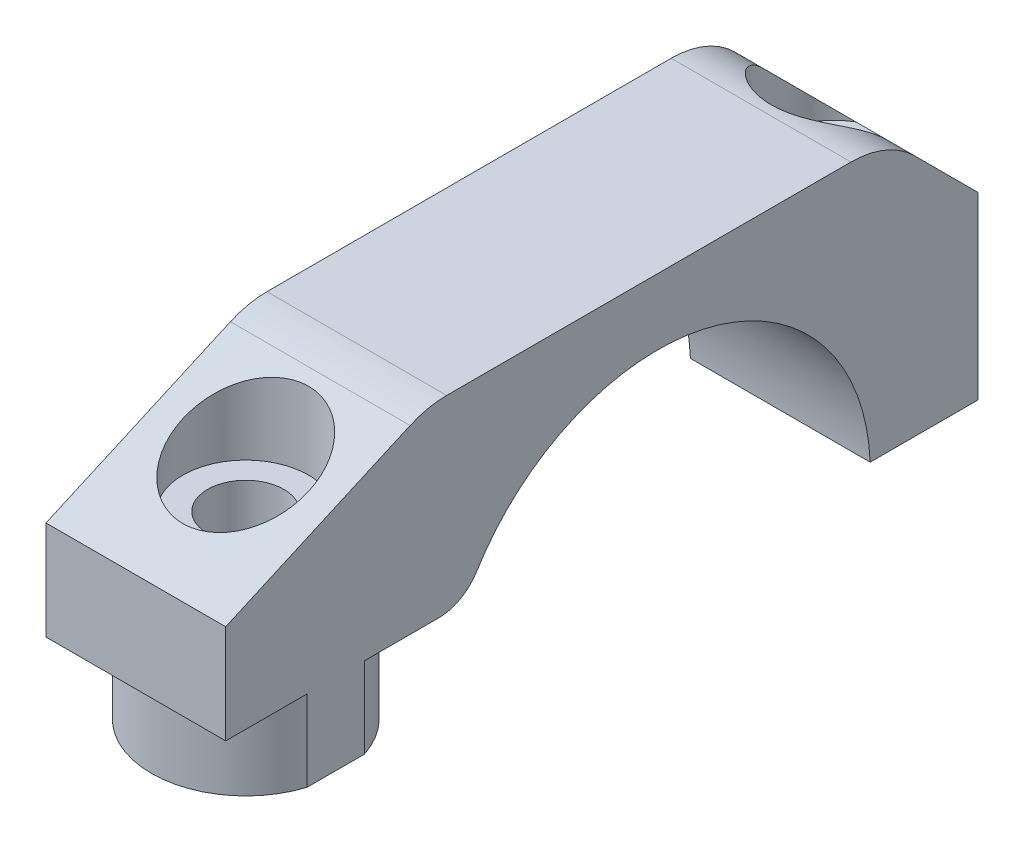
ISO-10303-21;
HEADER;
FILE_DESCRIPTION(('STEP AP214'),'2;1');
FILE_NAME('part.step','',(''),(''),'','','');
FILE_SCHEMA(('AUTOMOTIVE_DESIGN { 1 0 10303 214 1 1 1 1 }'));
ENDSEC;
DATA;
#1=APPLICATION_CONTEXT('core data for automotive mechanical design processes');
#2=APPLICATION_PROTOCOL_DEFINITION('international standard','automotive_design',2000,#1);
#3=PRODUCT_CONTEXT('',#1,'mechanical');
#4=PRODUCT('Part','Part','',(#3));
#5=PRODUCT_RELATED_PRODUCT_CATEGORY('part','',(#4));
#6=PRODUCT_DEFINITION_FORMATION('','',#4);
#7=PRODUCT_DEFINITION_CONTEXT('part definition',#1,'design');
#8=PRODUCT_DEFINITION('design','',#6,#7);
#9=PRODUCT_DEFINITION_SHAPE('','',#8);
#10=(LENGTH_UNIT() NAMED_UNIT(*) SI_UNIT(.MILLI.,.METRE.));
#11=(NAMED_UNIT(*) PLANE_ANGLE_UNIT() SI_UNIT($,.RADIAN.));
#12=(NAMED_UNIT(*) SI_UNIT($,.STERADIAN.) SOLID_ANGLE_UNIT());
#13=UNCERTAINTY_MEASURE_WITH_UNIT(LENGTH_MEASURE(1.E-05),#10,'distance_accuracy_value','');
#14=(GEOMETRIC_REPRESENTATION_CONTEXT(3) GLOBAL_UNCERTAINTY_ASSIGNED_CONTEXT((#13)) GLOBAL_UNIT_ASSIGNED_CONTEXT((#10,
#11,#12)) REPRESENTATION_CONTEXT('',''));
#15=CARTESIAN_POINT('',(0.,0.,0.));
#16=DIRECTION('',(0.,0.,1.));
#17=DIRECTION('',(1.,0.,0.));
#18=AXIS2_PLACEMENT_3D('',#15,#16,#17);
#19=CARTESIAN_POINT('',(20.,-30.,48.0832672382715));
#20=DIRECTION('',(0.,0.,-1.));
#21=DIRECTION('',(-1.,0.,0.));
#22=AXIS2_PLACEMENT_3D('',#19,#20,#21);
#23=PLANE('',#22);
#24=DIRECTION('',(-1.,0.,0.));
#25=VECTOR('',#24,1.);
#26=CARTESIAN_POINT('',(20.,-21.,48.0832672382715));
#27=LINE('',#26,#25);
#28=CARTESIAN_POINT('',(20.,-21.,48.0832672382715));
#29=VERTEX_POINT('',#28);
#30=CARTESIAN_POINT('',(0.,-21.,48.0832672382715));
#31=VERTEX_POINT('',#30);
#32=EDGE_CURVE('E72',#29,#31,#27,.T.);
#33=ORIENTED_EDGE('',*,*,#32,.F.);
#34=DIRECTION('',(0.,-1.,0.));
#35=VECTOR('',#34,1.);
#36=CARTESIAN_POINT('',(20.,-30.,48.0832672382715));
#37=LINE('',#36,#35);
#38=CARTESIAN_POINT('',(20.,-10.,48.0832672382715));
#39=VERTEX_POINT('',#38);
#40=EDGE_CURVE('E419',#39,#29,#37,.T.);
#41=ORIENTED_EDGE('',*,*,#40,.F.);
#42=DIRECTION('',(-1.,0.,0.));
#43=VECTOR('',#42,1.);
#44=CARTESIAN_POINT('',(20.,-10.,48.0832672382715));
#45=LINE('',#44,#43);
#46=CARTESIAN_POINT('',(0.,-10.,48.0832672382715));
#47=VERTEX_POINT('',#46);
#48=EDGE_CURVE('E223',#39,#47,#45,.T.);
#49=ORIENTED_EDGE('',*,*,#48,.T.);
#50=DIRECTION('',(0.,-1.,0.));
#51=VECTOR('',#50,1.);
#52=CARTESIAN_POINT('',(0.,-30.,48.0832672382715));
#53=LINE('',#52,#51);
#54=EDGE_CURVE('E189',#47,#31,#53,.T.);
#55=ORIENTED_EDGE('',*,*,#54,.T.);
#56=EDGE_LOOP('',(#33,#41,#49,#55));
#57=FACE_BOUND('',#56,.T.);
#58=ADVANCED_FACE('F49',(#57),#23,.F.);
#59=CARTESIAN_POINT('',(20.,-30.,24.6288488928259));
#60=DIRECTION('',(0.,1.,0.));
#61=DIRECTION('',(0.,0.,1.));
#62=AXIS2_PLACEMENT_3D('',#59,#60,#61);
#63=PLANE('',#62);
#64=CARTESIAN_POINT('',(10.,-30.,35.8560580655486));
#65=DIRECTION('',(0.,-1.,0.));
#66=DIRECTION('',(0.,0.,-1.));
#67=AXIS2_PLACEMENT_3D('',#64,#65,#66);
#68=CIRCLE('',#67,4.24999999999999);
#69=CARTESIAN_POINT('',(10.,-30.,31.6060580655487));
#70=VERTEX_POINT('',#69);
#71=EDGE_CURVE('E268',#70,#70,#68,.T.);
#72=ORIENTED_EDGE('',*,*,#71,.F.);
#73=EDGE_LOOP('',(#72));
#74=FACE_BOUND('',#73,.T.);
#75=CARTESIAN_POINT('',(10.,-30.,35.8560580655487));
#76=DIRECTION('',(0.,-1.,0.));
#77=DIRECTION('',(0.,0.,-1.));
#78=AXIS2_PLACEMENT_3D('',#75,#76,#77);
#79=CIRCLE('',#78,10.5);
#80=CARTESIAN_POINT('',(0.,-30.,32.6544959468323));
#81=VERTEX_POINT('',#80);
#82=CARTESIAN_POINT('',(20.,-30.,32.6544959468323));
#83=VERTEX_POINT('',#82);
#84=EDGE_CURVE('E396',#81,#83,#79,.T.);
#85=ORIENTED_EDGE('',*,*,#84,.T.);
#86=DIRECTION('',(0.,0.,-1.));
#87=VECTOR('',#86,1.);
#88=CARTESIAN_POINT('',(20.,-30.,24.6288488928259));
#89=LINE('',#88,#87);
#90=CARTESIAN_POINT('',(20.,-30.,39.0576201842651));
#91=VERTEX_POINT('',#90);
#92=EDGE_CURVE('E421',#91,#83,#89,.T.);
#93=ORIENTED_EDGE('',*,*,#92,.F.);
#94=CARTESIAN_POINT('',(0.,-30.,39.0576201842651));
#95=VERTEX_POINT('',#94);
#96=EDGE_CURVE('E395',#91,#95,#79,.T.);
#97=ORIENTED_EDGE('',*,*,#96,.T.);
#98=DIRECTION('',(0.,0.,-1.));
#99=VECTOR('',#98,1.);
#100=CARTESIAN_POINT('',(0.,-30.,24.6288488928259));
#101=LINE('',#100,#99);
#102=EDGE_CURVE('E185',#95,#81,#101,.T.);
#103=ORIENTED_EDGE('',*,*,#102,.T.);
#104=EDGE_LOOP('',(#85,#93,#97,#103));
#105=FACE_BOUND('',#104,.T.);
#106=ADVANCED_FACE('F312',(#74,#105),#63,.F.);
#107=CARTESIAN_POINT('',(20.,-31.,0.));
#108=DIRECTION('',(1.,0.,0.));
#109=DIRECTION('',(0.,0.,-1.));
#110=AXIS2_PLACEMENT_3D('',#107,#108,#109);
#111=PLANE('',#110);
#112=DIRECTION('',(0.,0.,-1.));
#113=VECTOR('',#112,1.);
#114=CARTESIAN_POINT('',(20.,-21.,0.));
#115=LINE('',#114,#113);
#116=CARTESIAN_POINT('',(20.,-21.,39.0576201842651));
#117=VERTEX_POINT('',#116);
#118=EDGE_CURVE('E402',#29,#117,#115,.T.);
#119=ORIENTED_EDGE('',*,*,#118,.T.);
#120=DIRECTION('',(0.,-1.,0.));
#121=VECTOR('',#120,1.);
#122=CARTESIAN_POINT('',(20.,62.5195240837166,39.0576201842651));
#123=LINE('',#122,#121);
#124=EDGE_CURVE('E179',#117,#91,#123,.T.);
#125=ORIENTED_EDGE('',*,*,#124,.T.);
#126=ORIENTED_EDGE('',*,*,#92,.T.);
#127=DIRECTION('',(0.,-1.,0.));
#128=VECTOR('',#127,1.);
#129=CARTESIAN_POINT('',(20.,62.5195240837166,32.6544959468323));
#130=LINE('',#129,#128);
#131=CARTESIAN_POINT('',(20.,-21.,32.6544959468323));
#132=VERTEX_POINT('',#131);
#133=EDGE_CURVE('E397',#83,#132,#130,.F.);
#134=ORIENTED_EDGE('',*,*,#133,.T.);
#135=DIRECTION('',(0.,0.,-1.));
#136=VECTOR('',#135,1.);
#137=CARTESIAN_POINT('',(20.,-21.,24.6288488928259));
#138=LINE('',#137,#136);
#139=CARTESIAN_POINT('',(20.,-21.,24.4094756191115));
#140=VERTEX_POINT('',#139);
#141=EDGE_CURVE('E392',#132,#140,#138,.T.);
#142=ORIENTED_EDGE('',*,*,#141,.T.);
#143=CARTESIAN_POINT('',(20.,-16.,24.4094756191115));
#144=DIRECTION('',(1.,0.,0.));
#145=DIRECTION('',(0.,0.,-1.));
#146=AXIS2_PLACEMENT_3D('',#143,#144,#145);
#147=CIRCLE('',#146,5.);
#148=CARTESIAN_POINT('',(20.,-18.6178010471204,20.1495322300868));
#149=VERTEX_POINT('',#148);
#150=EDGE_CURVE('E258',#140,#149,#147,.T.);
#151=ORIENTED_EDGE('',*,*,#150,.T.);
#152=CARTESIAN_POINT('',(20.,-31.,0.));
#153=DIRECTION('',(-1.,0.,0.));
#154=DIRECTION('',(0.,0.,-1.));
#155=AXIS2_PLACEMENT_3D('',#152,#153,#154);
#156=CIRCLE('',#155,23.65);
#157=CARTESIAN_POINT('',(20.,-30.,-23.6288488928259));
#158=VERTEX_POINT('',#157);
#159=EDGE_CURVE('E385',#149,#158,#156,.T.);
#160=ORIENTED_EDGE('',*,*,#159,.T.);
#161=DIRECTION('',(0.,0.,-1.));
#162=VECTOR('',#161,1.);
#163=CARTESIAN_POINT('',(20.,-30.,-35.6288488928259));
#164=LINE('',#163,#162);
#165=CARTESIAN_POINT('',(20.,-30.,-35.6288488928259));
#166=VERTEX_POINT('',#165);
#167=EDGE_CURVE('E383',#158,#166,#164,.T.);
#168=ORIENTED_EDGE('',*,*,#167,.T.);
#169=DIRECTION('',(0.,1.,0.));
#170=VECTOR('',#169,1.);
#171=CARTESIAN_POINT('',(20.,0.,-35.6288488928259));
#172=LINE('',#171,#170);
#173=CARTESIAN_POINT('',(20.,-10.,-35.6288488928259));
#174=VERTEX_POINT('',#173);
#175=EDGE_CURVE('E211',#166,#174,#172,.T.);
#176=ORIENTED_EDGE('',*,*,#175,.T.);
#177=DIRECTION('',(0.,-0.707106781186548,-0.707106781186547));
#178=VECTOR('',#177,1.);
#179=CARTESIAN_POINT('',(20.,-2.68557555358706,-28.314424446413));
#180=LINE('',#179,#178);
#181=CARTESIAN_POINT('',(20.,-2.92893218813453,-28.5577810809604));
#182=VERTEX_POINT('',#181);
#183=EDGE_CURVE('E220',#174,#182,#180,.F.);
#184=ORIENTED_EDGE('',*,*,#183,.T.);
#185=CARTESIAN_POINT('',(20.,-10.,-21.486713269095));
#186=DIRECTION('',(1.,0.,0.));
#187=DIRECTION('',(0.,0.,-1.));
#188=AXIS2_PLACEMENT_3D('',#185,#186,#187);
#189=CIRCLE('',#188,10.);
#190=CARTESIAN_POINT('',(20.,0.,-21.486713269095));
#191=VERTEX_POINT('',#190);
#192=EDGE_CURVE('E247',#182,#191,#189,.T.);
#193=ORIENTED_EDGE('',*,*,#192,.T.);
#194=DIRECTION('',(0.,0.,1.));
#195=VECTOR('',#194,1.);
#196=CARTESIAN_POINT('',(20.,0.,48.0832672382715));
#197=LINE('',#196,#195);
#198=CARTESIAN_POINT('',(20.,0.,23.4973338825292));
#199=VERTEX_POINT('',#198);
#200=EDGE_CURVE('E206',#191,#199,#197,.T.);
#201=ORIENTED_EDGE('',*,*,#200,.T.);
#202=CARTESIAN_POINT('',(20.,-10.,23.4973338825292));
#203=DIRECTION('',(1.,0.,0.));
#204=DIRECTION('',(0.,0.,-1.));
#205=AXIS2_PLACEMENT_3D('',#202,#203,#204);
#206=CIRCLE('',#205,10.);
#207=CARTESIAN_POINT('',(20.,-0.864545423574008,27.5647003132872));
#208=VERTEX_POINT('',#207);
#209=EDGE_CURVE('E245',#199,#208,#206,.T.);
#210=ORIENTED_EDGE('',*,*,#209,.T.);
#211=DIRECTION('',(0.,0.406736643075802,-0.9135454576426));
#212=VECTOR('',#211,1.);
#213=CARTESIAN_POINT('',(20.,4.39228698685211,15.7576614052186));
#214=LINE('',#213,#212);
#215=EDGE_CURVE('E229',#208,#39,#214,.F.);
#216=ORIENTED_EDGE('',*,*,#215,.T.);
#217=ORIENTED_EDGE('',*,*,#40,.T.);
#218=EDGE_LOOP('',(#119,#125,#126,#134,#142,#151,#160,#168,#176,#184,#193,#201,#210,#216,#217));
#219=FACE_BOUND('',#218,.T.);
#220=ADVANCED_FACE('F309',(#219),#111,.T.);
#221=CARTESIAN_POINT('',(0.,-31.,0.));
#222=DIRECTION('',(1.,0.,0.));
#223=DIRECTION('',(0.,0.,-1.));
#224=AXIS2_PLACEMENT_3D('',#221,#222,#223);
#225=PLANE('',#224);
#226=DIRECTION('',(0.,-1.,0.));
#227=VECTOR('',#226,1.);
#228=CARTESIAN_POINT('',(0.,62.5195240837166,39.0576201842651));
#229=LINE('',#228,#227);
#230=CARTESIAN_POINT('',(0.,-21.,39.0576201842651));
#231=VERTEX_POINT('',#230);
#232=EDGE_CURVE('E14',#231,#95,#229,.T.);
#233=ORIENTED_EDGE('',*,*,#232,.F.);
#234=DIRECTION('',(0.,0.,-1.));
#235=VECTOR('',#234,1.);
#236=CARTESIAN_POINT('',(0.,-21.,0.));
#237=LINE('',#236,#235);
#238=EDGE_CURVE('E166',#31,#231,#237,.T.);
#239=ORIENTED_EDGE('',*,*,#238,.F.);
#240=ORIENTED_EDGE('',*,*,#54,.F.);
#241=DIRECTION('',(0.,-0.406736643075802,0.9135454576426));
#242=VECTOR('',#241,1.);
#243=CARTESIAN_POINT('',(0.,-10.,48.0832672382715));
#244=LINE('',#243,#242);
#245=CARTESIAN_POINT('',(0.,-0.864545423574005,27.5647003132872));
#246=VERTEX_POINT('',#245);
#247=EDGE_CURVE('E226',#47,#246,#244,.F.);
#248=ORIENTED_EDGE('',*,*,#247,.T.);
#249=CARTESIAN_POINT('',(0.,-10.,23.4973338825292));
#250=DIRECTION('',(1.,0.,0.));
#251=DIRECTION('',(0.,0.,-1.));
#252=AXIS2_PLACEMENT_3D('',#249,#250,#251);
#253=CIRCLE('',#252,10.);
#254=CARTESIAN_POINT('',(0.,0.,23.4973338825292));
#255=VERTEX_POINT('',#254);
#256=EDGE_CURVE('E237',#246,#255,#253,.F.);
#257=ORIENTED_EDGE('',*,*,#256,.T.);
#258=DIRECTION('',(0.,0.,1.));
#259=VECTOR('',#258,1.);
#260=CARTESIAN_POINT('',(0.,0.,35.6288488928259));
#261=LINE('',#260,#259);
#262=CARTESIAN_POINT('',(0.,0.,-21.486713269095));
#263=VERTEX_POINT('',#262);
#264=EDGE_CURVE('E203',#263,#255,#261,.T.);
#265=ORIENTED_EDGE('',*,*,#264,.F.);
#266=CARTESIAN_POINT('',(0.,-10.,-21.486713269095));
#267=DIRECTION('',(1.,0.,0.));
#268=DIRECTION('',(0.,0.,-1.));
#269=AXIS2_PLACEMENT_3D('',#266,#267,#268);
#270=CIRCLE('',#269,10.);
#271=CARTESIAN_POINT('',(0.,-2.92893218813453,-28.5577810809604));
#272=VERTEX_POINT('',#271);
#273=EDGE_CURVE('E239',#263,#272,#270,.F.);
#274=ORIENTED_EDGE('',*,*,#273,.T.);
#275=DIRECTION('',(0.,0.707106781186548,0.707106781186547));
#276=VECTOR('',#275,1.);
#277=CARTESIAN_POINT('',(0.,0.,-25.6288488928259));
#278=LINE('',#277,#276);
#279=CARTESIAN_POINT('',(0.,-10.,-35.6288488928259));
#280=VERTEX_POINT('',#279);
#281=EDGE_CURVE('E214',#272,#280,#278,.F.);
#282=ORIENTED_EDGE('',*,*,#281,.T.);
#283=DIRECTION('',(0.,1.,0.));
#284=VECTOR('',#283,1.);
#285=CARTESIAN_POINT('',(0.,0.,-35.6288488928259));
#286=LINE('',#285,#284);
#287=CARTESIAN_POINT('',(0.,-30.,-35.6288488928259));
#288=VERTEX_POINT('',#287);
#289=EDGE_CURVE('E200',#288,#280,#286,.T.);
#290=ORIENTED_EDGE('',*,*,#289,.F.);
#291=DIRECTION('',(0.,0.,-1.));
#292=VECTOR('',#291,1.);
#293=CARTESIAN_POINT('',(0.,-30.,-35.6288488928259));
#294=LINE('',#293,#292);
#295=CARTESIAN_POINT('',(0.,-30.,-23.6288488928259));
#296=VERTEX_POINT('',#295);
#297=EDGE_CURVE('E198',#296,#288,#294,.T.);
#298=ORIENTED_EDGE('',*,*,#297,.F.);
#299=CARTESIAN_POINT('',(0.,-31.,0.));
#300=DIRECTION('',(-1.,0.,0.));
#301=DIRECTION('',(0.,0.,-1.));
#302=AXIS2_PLACEMENT_3D('',#299,#300,#301);
#303=CIRCLE('',#302,23.65);
#304=CARTESIAN_POINT('',(0.,-18.6178010471204,20.1495322300868));
#305=VERTEX_POINT('',#304);
#306=EDGE_CURVE('E191',#305,#296,#303,.T.);
#307=ORIENTED_EDGE('',*,*,#306,.F.);
#308=CARTESIAN_POINT('',(0.,-16.,24.4094756191115));
#309=DIRECTION('',(1.,0.,0.));
#310=DIRECTION('',(0.,0.,-1.));
#311=AXIS2_PLACEMENT_3D('',#308,#309,#310);
#312=CIRCLE('',#311,5.);
#313=CARTESIAN_POINT('',(0.,-21.,24.4094756191115));
#314=VERTEX_POINT('',#313);
#315=EDGE_CURVE('E254',#305,#314,#312,.F.);
#316=ORIENTED_EDGE('',*,*,#315,.T.);
#317=DIRECTION('',(0.,0.,-1.));
#318=VECTOR('',#317,1.);
#319=CARTESIAN_POINT('',(0.,-21.,24.6288488928259));
#320=LINE('',#319,#318);
#321=CARTESIAN_POINT('',(0.,-21.,32.6544959468323));
#322=VERTEX_POINT('',#321);
#323=EDGE_CURVE('E64',#322,#314,#320,.T.);
#324=ORIENTED_EDGE('',*,*,#323,.F.);
#325=DIRECTION('',(0.,-1.,0.));
#326=VECTOR('',#325,1.);
#327=CARTESIAN_POINT('',(0.,62.5195240837166,32.6544959468323));
#328=LINE('',#327,#326);
#329=EDGE_CURVE('E57',#81,#322,#328,.F.);
#330=ORIENTED_EDGE('',*,*,#329,.F.);
#331=ORIENTED_EDGE('',*,*,#102,.F.);
#332=EDGE_LOOP('',(#233,#239,#240,#248,#257,#265,#274,#282,#290,#298,#307,#316,#324,#330,#331));
#333=FACE_BOUND('',#332,.T.);
#334=ADVANCED_FACE('F183',(#333),#225,.F.);
#335=CARTESIAN_POINT('',(20.,0.,-25.6288488928259));
#336=DIRECTION('',(0.,-0.707106781186547,0.707106781186548));
#337=DIRECTION('',(-1.,0.,0.));
#338=AXIS2_PLACEMENT_3D('',#335,#336,#337);
#339=PLANE('',#338);
#340=CARTESIAN_POINT('',(10.,-4.,-29.6288488928259));
#341=DIRECTION('',(0.,-0.707106781186547,0.707106781186548));
#342=DIRECTION('',(0.,0.707106781186548,0.707106781186547));
#343=AXIS2_PLACEMENT_3D('',#340,#341,#342);
#344=ELLIPSE('',#343,9.89949493661167,7.);
#345=CARTESIAN_POINT('',(16.9175728216178,-2.92893218813453,-28.5577810809604));
#346=VERTEX_POINT('',#345);
#347=CARTESIAN_POINT('',(13.605551275464,-10.,-35.6288488928259));
#348=VERTEX_POINT('',#347);
#349=EDGE_CURVE('E411',#346,#348,#344,.F.);
#350=ORIENTED_EDGE('',*,*,#349,.F.);
#351=DIRECTION('',(-1.,0.,0.));
#352=VECTOR('',#351,1.);
#353=CARTESIAN_POINT('',(20.,-2.92893218813453,-28.5577810809604));
#354=LINE('',#353,#352);
#355=EDGE_CURVE('E241',#346,#182,#354,.F.);
#356=ORIENTED_EDGE('',*,*,#355,.T.);
#357=ORIENTED_EDGE('',*,*,#183,.F.);
#358=DIRECTION('',(1.,0.,0.));
#359=VECTOR('',#358,1.);
#360=CARTESIAN_POINT('',(20.,-10.,-35.6288488928259));
#361=LINE('',#360,#359);
#362=EDGE_CURVE('E216',#348,#174,#361,.T.);
#363=ORIENTED_EDGE('',*,*,#362,.F.);
#364=EDGE_LOOP('',(#350,#356,#357,#363));
#365=FACE_BOUND('',#364,.T.);
#366=ADVANCED_FACE('F307',(#365),#339,.F.);
#367=CARTESIAN_POINT('',(10.,-30.,-29.6288488928259));
#368=DIRECTION('',(0.,-1.,0.));
#369=DIRECTION('',(0.,0.,-1.));
#370=AXIS2_PLACEMENT_3D('',#367,#368,#369);
#371=CYLINDRICAL_SURFACE('',#370,4.24999999999999);
#372=CARTESIAN_POINT('',(10.,-30.,-29.6288488928259));
#373=DIRECTION('',(0.,-1.,0.));
#374=DIRECTION('',(0.,0.,-1.));
#375=AXIS2_PLACEMENT_3D('',#372,#373,#374);
#376=CIRCLE('',#375,4.24999999999999);
#377=CARTESIAN_POINT('',(10.,-30.,-33.8788488928259));
#378=VERTEX_POINT('',#377);
#379=EDGE_CURVE('E193',#378,#378,#376,.T.);
#380=ORIENTED_EDGE('',*,*,#379,.T.);
#381=EDGE_LOOP('',(#380));
#382=FACE_BOUND('',#381,.T.);
#383=CARTESIAN_POINT('',(10.,-9.99999999999999,-29.6288488928259));
#384=DIRECTION('',(0.,1.,0.));
#385=DIRECTION('',(0.,0.,1.));
#386=AXIS2_PLACEMENT_3D('',#383,#384,#385);
#387=CIRCLE('',#386,4.24999999999999);
#388=CARTESIAN_POINT('',(10.,-9.99999999999999,-25.3788488928259));
#389=VERTEX_POINT('',#388);
#390=EDGE_CURVE('E269',#389,#389,#387,.F.);
#391=ORIENTED_EDGE('',*,*,#390,.F.);
#392=EDGE_LOOP('',(#391));
#393=FACE_BOUND('',#392,.T.);
#394=ADVANCED_FACE('F303',(#382,#393),#371,.F.);
#395=CARTESIAN_POINT('',(10.,-30.,35.8560580655486));
#396=DIRECTION('',(0.,-1.,0.));
#397=DIRECTION('',(0.,0.,-1.));
#398=AXIS2_PLACEMENT_3D('',#395,#396,#397);
#399=CYLINDRICAL_SURFACE('',#398,4.24999999999999);
#400=ORIENTED_EDGE('',*,*,#71,.T.);
#401=EDGE_LOOP('',(#400));
#402=FACE_BOUND('',#401,.T.);
#403=CARTESIAN_POINT('',(10.,-10.,35.8560580655486));
#404=DIRECTION('',(0.,1.,0.));
#405=DIRECTION('',(0.,0.,1.));
#406=AXIS2_PLACEMENT_3D('',#403,#404,#405);
#407=CIRCLE('',#406,4.24999999999999);
#408=CARTESIAN_POINT('',(10.,-10.,40.1060580655486));
#409=VERTEX_POINT('',#408);
#410=EDGE_CURVE('E261',#409,#409,#407,.F.);
#411=ORIENTED_EDGE('',*,*,#410,.F.);
#412=EDGE_LOOP('',(#411));
#413=FACE_BOUND('',#412,.T.);
#414=ADVANCED_FACE('F299',(#402,#413),#399,.F.);
#415=CARTESIAN_POINT('',(20.,-21.,24.6288488928259));
#416=DIRECTION('',(0.,1.,0.));
#417=DIRECTION('',(0.,0.,1.));
#418=AXIS2_PLACEMENT_3D('',#415,#416,#417);
#419=PLANE('',#418);
#420=ORIENTED_EDGE('',*,*,#323,.T.);
#421=DIRECTION('',(-1.,0.,0.));
#422=VECTOR('',#421,1.);
#423=CARTESIAN_POINT('',(20.,-21.,24.4094756191115));
#424=LINE('',#423,#422);
#425=EDGE_CURVE('E256',#314,#140,#424,.F.);
#426=ORIENTED_EDGE('',*,*,#425,.T.);
#427=ORIENTED_EDGE('',*,*,#141,.F.);
#428=CARTESIAN_POINT('',(10.,-21.,35.8560580655487));
#429=DIRECTION('',(0.,-1.,0.));
#430=DIRECTION('',(0.,0.,-1.));
#431=AXIS2_PLACEMENT_3D('',#428,#429,#430);
#432=CIRCLE('',#431,10.5);
#433=EDGE_CURVE('E180',#132,#322,#432,.F.);
#434=ORIENTED_EDGE('',*,*,#433,.T.);
#435=EDGE_LOOP('',(#420,#426,#427,#434));
#436=FACE_BOUND('',#435,.T.);
#437=ADVANCED_FACE('F302',(#436),#419,.F.);
#438=CARTESIAN_POINT('',(20.,-31.,0.));
#439=DIRECTION('',(-1.,0.,0.));
#440=DIRECTION('',(0.,0.,1.));
#441=AXIS2_PLACEMENT_3D('',#438,#439,#440);
#442=CYLINDRICAL_SURFACE('',#441,23.65);
#443=ORIENTED_EDGE('',*,*,#159,.F.);
#444=DIRECTION('',(-1.,0.,0.));
#445=VECTOR('',#444,1.);
#446=CARTESIAN_POINT('',(20.,-18.6178010471204,20.1495322300868));
#447=LINE('',#446,#445);
#448=EDGE_CURVE('E251',#149,#305,#447,.T.);
#449=ORIENTED_EDGE('',*,*,#448,.T.);
#450=ORIENTED_EDGE('',*,*,#306,.T.);
#451=DIRECTION('',(-1.,0.,0.));
#452=VECTOR('',#451,1.);
#453=CARTESIAN_POINT('',(20.,-30.,-23.6288488928259));
#454=LINE('',#453,#452);
#455=EDGE_CURVE('E210',#158,#296,#454,.T.);
#456=ORIENTED_EDGE('',*,*,#455,.F.);
#457=EDGE_LOOP('',(#443,#449,#450,#456));
#458=FACE_BOUND('',#457,.T.);
#459=ADVANCED_FACE('F328',(#458),#442,.F.);
#460=CARTESIAN_POINT('',(20.,-30.,-35.6288488928259));
#461=DIRECTION('',(0.,1.,0.));
#462=DIRECTION('',(0.,0.,1.));
#463=AXIS2_PLACEMENT_3D('',#460,#461,#462);
#464=PLANE('',#463);
#465=ORIENTED_EDGE('',*,*,#379,.F.);
#466=EDGE_LOOP('',(#465));
#467=FACE_BOUND('',#466,.T.);
#468=ORIENTED_EDGE('',*,*,#297,.T.);
#469=DIRECTION('',(-1.,0.,0.));
#470=VECTOR('',#469,1.);
#471=CARTESIAN_POINT('',(20.,-30.,-35.6288488928259));
#472=LINE('',#471,#470);
#473=EDGE_CURVE('E207',#166,#288,#472,.T.);
#474=ORIENTED_EDGE('',*,*,#473,.F.);
#475=ORIENTED_EDGE('',*,*,#167,.F.);
#476=ORIENTED_EDGE('',*,*,#455,.T.);
#477=EDGE_LOOP('',(#468,#474,#475,#476));
#478=FACE_BOUND('',#477,.T.);
#479=ADVANCED_FACE('F324',(#467,#478),#464,.F.);
#480=CARTESIAN_POINT('',(20.,0.,-35.6288488928259));
#481=DIRECTION('',(0.,0.,1.));
#482=DIRECTION('',(0.,-1.,0.));
#483=AXIS2_PLACEMENT_3D('',#480,#481,#482);
#484=PLANE('',#483);
#485=ORIENTED_EDGE('',*,*,#289,.T.);
#486=CARTESIAN_POINT('',(6.39444872453598,-10.,-35.6288488928259));
#487=VERTEX_POINT('',#486);
#488=EDGE_CURVE('E217',#280,#487,#361,.T.);
#489=ORIENTED_EDGE('',*,*,#488,.T.);
#490=DIRECTION('',(-1.,0.,0.));
#491=VECTOR('',#490,1.);
#492=CARTESIAN_POINT('',(20.,-9.99999999999999,-35.6288488928259));
#493=LINE('',#492,#491);
#494=EDGE_CURVE('E272',#487,#348,#493,.F.);
#495=ORIENTED_EDGE('',*,*,#494,.T.);
#496=ORIENTED_EDGE('',*,*,#362,.T.);
#497=ORIENTED_EDGE('',*,*,#175,.F.);
#498=ORIENTED_EDGE('',*,*,#473,.T.);
#499=EDGE_LOOP('',(#485,#489,#495,#496,#497,#498));
#500=FACE_BOUND('',#499,.T.);
#501=ADVANCED_FACE('F320',(#500),#484,.F.);
#502=CARTESIAN_POINT('',(20.,0.,35.6288488928259));
#503=DIRECTION('',(0.,-1.,0.));
#504=DIRECTION('',(0.,0.,-1.));
#505=AXIS2_PLACEMENT_3D('',#502,#503,#504);
#506=PLANE('',#505);
#507=ORIENTED_EDGE('',*,*,#200,.F.);
#508=DIRECTION('',(1.,0.,0.));
#509=VECTOR('',#508,1.);
#510=CARTESIAN_POINT('',(0.,0.,-21.486713269095));
#511=LINE('',#510,#509);
#512=EDGE_CURVE('E234',#191,#263,#511,.F.);
#513=ORIENTED_EDGE('',*,*,#512,.T.);
#514=ORIENTED_EDGE('',*,*,#264,.T.);
#515=DIRECTION('',(-1.,0.,0.));
#516=VECTOR('',#515,1.);
#517=CARTESIAN_POINT('',(20.,0.,23.4973338825292));
#518=LINE('',#517,#516);
#519=EDGE_CURVE('E231',#255,#199,#518,.F.);
#520=ORIENTED_EDGE('',*,*,#519,.T.);
#521=EDGE_LOOP('',(#507,#513,#514,#520));
#522=FACE_BOUND('',#521,.T.);
#523=ADVANCED_FACE('F316',(#522),#506,.F.);
#524=CARTESIAN_POINT('',(3.08242717838217,-2.92893218813453,-28.5577810809604));
#525=VERTEX_POINT('',#524);
#526=EDGE_CURVE('E374',#487,#525,#344,.F.);
#527=ORIENTED_EDGE('',*,*,#526,.F.);
#528=ORIENTED_EDGE('',*,*,#488,.F.);
#529=ORIENTED_EDGE('',*,*,#281,.F.);
#530=EDGE_CURVE('E242',#272,#525,#354,.F.);
#531=ORIENTED_EDGE('',*,*,#530,.T.);
#532=EDGE_LOOP('',(#527,#528,#529,#531));
#533=FACE_BOUND('',#532,.T.);
#534=ADVANCED_FACE('F319',(#533),#339,.F.);
#535=CARTESIAN_POINT('',(20.,-10.,48.0832672382715));
#536=DIRECTION('',(0.,-0.9135454576426,-0.406736643075802));
#537=DIRECTION('',(-1.,0.,0.));
#538=AXIS2_PLACEMENT_3D('',#535,#536,#537);
#539=PLANE('',#538);
#540=CARTESIAN_POINT('',(10.,-4.55609573503615,35.8560580655487));
#541=DIRECTION('',(0.,-0.9135454576426,-0.406736643075802));
#542=DIRECTION('',(0.,0.406736643075802,-0.9135454576426));
#543=AXIS2_PLACEMENT_3D('',#540,#541,#542);
#544=ELLIPSE('',#543,7.66245394954233,7.);
#545=CARTESIAN_POINT('',(10.,-1.43949493787638,28.8560580655487));
#546=VERTEX_POINT('',#545);
#547=EDGE_CURVE('E264',#546,#546,#544,.F.);
#548=ORIENTED_EDGE('',*,*,#547,.F.);
#549=EDGE_LOOP('',(#548));
#550=FACE_BOUND('',#549,.T.);
#551=ORIENTED_EDGE('',*,*,#215,.F.);
#552=DIRECTION('',(1.,0.,0.));
#553=VECTOR('',#552,1.);
#554=CARTESIAN_POINT('',(0.,-0.864545423574007,27.5647003132872));
#555=LINE('',#554,#553);
#556=EDGE_CURVE('E249',#208,#246,#555,.F.);
#557=ORIENTED_EDGE('',*,*,#556,.T.);
#558=ORIENTED_EDGE('',*,*,#247,.F.);
#559=ORIENTED_EDGE('',*,*,#48,.F.);
#560=EDGE_LOOP('',(#551,#557,#558,#559));
#561=FACE_BOUND('',#560,.T.);
#562=ADVANCED_FACE('F343',(#550,#561),#539,.F.);
#563=CARTESIAN_POINT('',(20.,-10.,-21.486713269095));
#564=DIRECTION('',(-1.,0.,0.));
#565=DIRECTION('',(0.,0.,1.));
#566=AXIS2_PLACEMENT_3D('',#563,#564,#565);
#567=CYLINDRICAL_SURFACE('',#566,10.);
#568=CARTESIAN_POINT('',(3.25104897340406,-10.,-31.486713269095));
#569=CARTESIAN_POINT('',(3.25106087273873,-9.85091478951348,-31.4867160515109));
#570=CARTESIAN_POINT('',(3.25013148630329,-9.70183226358154,-31.483379342973));
#571=CARTESIAN_POINT('',(3.24647710693442,-9.40399291809771,-31.4700484813892));
#572=CARTESIAN_POINT('',(3.24375218519055,-9.25523608586728,-31.4600545922876));
#573=CARTESIAN_POINT('',(3.23659498655821,-8.95841047276632,-31.4334357355749));
#574=CARTESIAN_POINT('',(3.23216332974254,-8.81034146175375,-31.4168131761439));
#575=CARTESIAN_POINT('',(3.22176676133984,-8.51515717825567,-31.376982744969));
#576=CARTESIAN_POINT('',(3.21580184059934,-8.36804191146932,-31.3537748339109));
#577=CARTESIAN_POINT('',(3.19591204103608,-7.92819055677791,-31.2742776260554));
#578=CARTESIAN_POINT('',(3.18000045425675,-7.63726038579745,-31.2081428460162));
#579=CARTESIAN_POINT('',(3.14535391057183,-7.06266947346861,-31.0502326551254));
#580=CARTESIAN_POINT('',(3.12661894157457,-6.77900876325916,-30.9584571344611));
#581=CARTESIAN_POINT('',(3.09085533331328,-6.24061967162347,-30.7572972289866));
#582=CARTESIAN_POINT('',(3.0737993759702,-5.98525977909658,-30.6496058544838));
#583=CARTESIAN_POINT('',(3.04307361432924,-5.48416842170842,-30.4133022898316));
#584=CARTESIAN_POINT('',(3.02940390788726,-5.23843723527031,-30.2846894952726));
#585=CARTESIAN_POINT('',(3.00887650767965,-4.75871914546023,-30.0076030502565));
#586=CARTESIAN_POINT('',(3.00200635361753,-4.52471150868786,-29.8591662964289));
#587=CARTESIAN_POINT('',(2.99874257849858,-4.06979282018192,-29.5433402080768));
#588=CARTESIAN_POINT('',(3.00234553301687,-3.84887751171138,-29.3759570857054));
#589=CARTESIAN_POINT('',(3.02118200131667,-3.47706354875361,-29.0691622013336));
#590=CARTESIAN_POINT('',(3.03318324597067,-3.32277881302777,-28.9336398936879));
#591=CARTESIAN_POINT('',(3.06679235948941,-3.02340240517486,-28.6539315968349));
#592=CARTESIAN_POINT('',(3.08839782964889,-2.87830844793436,-28.5097477786565));
#593=CARTESIAN_POINT('',(3.14283483451019,-2.59828134257704,-28.2139716985132));
#594=CARTESIAN_POINT('',(3.17565931527038,-2.46334187472749,-28.0623841428477));
#595=CARTESIAN_POINT('',(3.25407448566014,-2.20440529577576,-27.7532393714116));
#596=CARTESIAN_POINT('',(3.29966536616892,-2.08040834831917,-27.5956820664135));
#597=CARTESIAN_POINT('',(3.40542005625007,-1.84310173359182,-27.275075050627));
#598=CARTESIAN_POINT('',(3.46570984738247,-1.72989690536207,-27.1119889583038));
#599=CARTESIAN_POINT('',(3.60170082655873,-1.51605696838421,-26.783980250902));
#600=CARTESIAN_POINT('',(3.67740206966309,-1.41542190454619,-26.6190576292641));
#601=CARTESIAN_POINT('',(3.84480220851703,-1.22709360588036,-26.2900486640683));
#602=CARTESIAN_POINT('',(3.93649362400517,-1.13939435488435,-26.1259619662402));
#603=CARTESIAN_POINT('',(4.13603176094283,-0.976844730803236,-25.8012959065607));
#604=CARTESIAN_POINT('',(4.24387636085419,-0.901992673150781,-25.6407160872893));
#605=CARTESIAN_POINT('',(4.459412547012,-0.774132632158053,-25.3474572534673));
#606=CARTESIAN_POINT('',(4.56508419167397,-0.719536173422421,-25.213978967328));
#607=CARTESIAN_POINT('',(4.78766366894598,-0.619040230167476,-24.9532830816655));
#608=CARTESIAN_POINT('',(4.90457033119175,-0.573139841245875,-24.8260648321105));
#609=CARTESIAN_POINT('',(5.14894195354716,-0.489345456719461,-24.5793549361821));
#610=CARTESIAN_POINT('',(5.2764079296411,-0.451452232787541,-24.4598640352843));
#611=CARTESIAN_POINT('',(5.54105166045161,-0.38286650036751,-24.2299128753548));
#612=CARTESIAN_POINT('',(5.67822971383982,-0.352174213452263,-24.1194528942727));
#613=CARTESIAN_POINT('',(5.95935387832766,-0.297502011688311,-23.9101552096561));
#614=CARTESIAN_POINT('',(6.10317730581924,-0.273433564427748,-23.811175607254));
#615=CARTESIAN_POINT('',(6.39844889946956,-0.230574903803955,-23.6239002000955));
#616=CARTESIAN_POINT('',(6.54990028642627,-0.211786942460261,-23.5356089628191));
#617=CARTESIAN_POINT('',(6.85940153980237,-0.178666610658496,-23.3704614975087));
#618=CARTESIAN_POINT('',(7.01745224672145,-0.164334809719416,-23.2936067317652));
#619=CARTESIAN_POINT('',(7.3390680205157,-0.139361978987537,-23.1519430486678));
#620=CARTESIAN_POINT('',(7.50263104729697,-0.128719599856776,-23.0871297314095));
#621=CARTESIAN_POINT('',(7.84518673555649,-0.109836171255338,-22.966124377908));
#622=CARTESIAN_POINT('',(8.02448853517864,-0.101797925862749,-22.9107744630626));
#623=CARTESIAN_POINT('',(8.38705338088027,-0.0884413808725818,-22.8146297778829));
#624=CARTESIAN_POINT('',(8.57031657407074,-0.0831231824686295,-22.7738355490794));
#625=CARTESIAN_POINT('',(8.93960945513231,-0.0746878512466138,-22.7070871559956));
#626=CARTESIAN_POINT('',(9.12563963178073,-0.0715711121383988,-22.681135646351));
#627=CARTESIAN_POINT('',(9.4992051902633,-0.0672047228269683,-22.6442633972915));
#628=CARTESIAN_POINT('',(9.68674059159313,-0.0659550968459512,-22.6333428528746));
#629=CARTESIAN_POINT('',(10.0689306964056,-0.0651655367923632,-22.6264854496615));
#630=CARTESIAN_POINT('',(10.2635958261885,-0.0656895571222264,-22.6311090438787));
#631=CARTESIAN_POINT('',(10.651854530289,-0.0686535787803541,-22.6565511382115));
#632=CARTESIAN_POINT('',(10.8454480732925,-0.0710936358050208,-22.677370109103));
#633=CARTESIAN_POINT('',(11.2302231654711,-0.0781812304605688,-22.7350545153133));
#634=CARTESIAN_POINT('',(11.4214043122192,-0.082829131526256,-22.7719225924034));
#635=CARTESIAN_POINT('',(11.7999532321424,-0.094839830954736,-22.8614272979766));
#636=CARTESIAN_POINT('',(11.9873210272641,-0.102202613688237,-22.914063835682));
#637=CARTESIAN_POINT('',(12.3573367195454,-0.12037277318899,-23.0348417701988));
#638=CARTESIAN_POINT('',(12.5399718327445,-0.13118860273879,-23.1030210961613));
#639=CARTESIAN_POINT('',(12.8986707344232,-0.157148922488685,-23.2542438662649));
#640=CARTESIAN_POINT('',(13.0747344602422,-0.172293453952593,-23.3372874520985));
#641=CARTESIAN_POINT('',(13.4188912957222,-0.207940041921981,-23.5174742076293));
#642=CARTESIAN_POINT('',(13.5869859180458,-0.228441076828489,-23.6146146871806));
#643=CARTESIAN_POINT('',(13.9138909270337,-0.275930851018514,-23.8220490254525));
#644=CARTESIAN_POINT('',(14.072701693069,-0.30291932497169,-23.932342346141));
#645=CARTESIAN_POINT('',(14.3748735122622,-0.363573620778393,-24.161193564056));
#646=CARTESIAN_POINT('',(14.5185647352435,-0.397000648266759,-24.2793786379333));
#647=CARTESIAN_POINT('',(14.7949283739795,-0.472062994199678,-24.5256235095239));
#648=CARTESIAN_POINT('',(14.9276010599186,-0.513698111289949,-24.6536830649574));
#649=CARTESIAN_POINT('',(15.1808801883423,-0.606078797711524,-24.9180141596848));
#650=CARTESIAN_POINT('',(15.3014943704564,-0.65681846415958,-25.0542803404533));
#651=CARTESIAN_POINT('',(15.5299832801669,-0.768187214954961,-25.3332938888364));
#652=CARTESIAN_POINT('',(15.6378587640788,-0.828815711678195,-25.4760408709788));
#653=CARTESIAN_POINT('',(15.8336949706758,-0.956146562358103,-25.7564722145436));
#654=CARTESIAN_POINT('',(15.9224997425222,-1.02218498267942,-25.8938699193961));
#655=CARTESIAN_POINT('',(16.0884084440948,-1.16357028687405,-26.1709088111424));
#656=CARTESIAN_POINT('',(16.1655129906629,-1.23891667964607,-26.3105498793353));
#657=CARTESIAN_POINT('',(16.3081288261175,-1.39893180866669,-26.5903987507571));
#658=CARTESIAN_POINT('',(16.3736400700065,-1.48360058109656,-26.7306065561836));
#659=CARTESIAN_POINT('',(16.4934334565725,-1.66208024089797,-27.0099888320974));
#660=CARTESIAN_POINT('',(16.5477152394661,-1.75589142104376,-27.1491632693386));
#661=CARTESIAN_POINT('',(16.6458305140755,-1.95269478033539,-27.4255492705808));
#662=CARTESIAN_POINT('',(16.6896222220221,-2.05572150151726,-27.5627510036565));
#663=CARTESIAN_POINT('',(16.7672680078277,-2.27016850331332,-27.8333272586688));
#664=CARTESIAN_POINT('',(16.8011222987461,-2.38158860390809,-27.9667018626042));
#665=CARTESIAN_POINT('',(16.8598311725918,-2.61233380547213,-28.2285866983618));
#666=CARTESIAN_POINT('',(16.884681967979,-2.73166220834996,-28.3570948626886));
#667=CARTESIAN_POINT('',(16.9263780725146,-2.9776196043112,-28.6083070077473));
#668=CARTESIAN_POINT('',(16.9432217602078,-3.10425007026031,-28.7310098083556));
#669=CARTESIAN_POINT('',(16.9756044256173,-3.41923841328,-29.0204133915795));
#670=CARTESIAN_POINT('',(16.9875783280221,-3.61105099409279,-29.183772696573));
#671=CARTESIAN_POINT('',(17.0004761562699,-4.00671273778004,-29.4957107956201));
#672=CARTESIAN_POINT('',(17.0013961237007,-4.21056618622851,-29.6442842759854));
#673=CARTESIAN_POINT('',(16.9951185556509,-4.62917396565762,-29.9257865107943));
#674=CARTESIAN_POINT('',(16.9879068580632,-4.84394669074125,-30.0586875241993));
#675=CARTESIAN_POINT('',(16.9681203518004,-5.28269735925915,-30.307750319769));
#676=CARTESIAN_POINT('',(16.955546078649,-5.50667438150579,-30.4239137718498));
#677=CARTESIAN_POINT('',(16.9273606767301,-5.96634591439123,-30.6406883542959));
#678=CARTESIAN_POINT('',(16.9117032042434,-6.20217221965935,-30.741013763978));
#679=CARTESIAN_POINT('',(16.879900398414,-6.68082367357562,-30.9232729081182));
#680=CARTESIAN_POINT('',(16.8637550108187,-6.92364960038991,-31.00520458873));
#681=CARTESIAN_POINT('',(16.8331051484548,-7.41452744101413,-31.1500821566789));
#682=CARTESIAN_POINT('',(16.81859776277,-7.66256912434219,-31.2130620661671));
#683=CARTESIAN_POINT('',(16.7929084039994,-8.16282975331435,-31.3198303512831));
#684=CARTESIAN_POINT('',(16.7817251808714,-8.41504709095249,-31.3636259440618));
#685=CARTESIAN_POINT('',(16.765088613793,-8.88922608520618,-31.4273223509773));
#686=CARTESIAN_POINT('',(16.7590787045027,-9.11085000545667,-31.4495923438509));
#687=CARTESIAN_POINT('',(16.7530253232851,-9.44397114429133,-31.4718629199111));
#688=CARTESIAN_POINT('',(16.7515011232466,-9.5550930588874,-31.4774307076417));
#689=CARTESIAN_POINT('',(16.7494625644646,-9.7774739123955,-31.4848560569884));
#690=CARTESIAN_POINT('',(16.7489482412924,-9.88873285599607,-31.4867134879124));
#691=CARTESIAN_POINT('',(16.7489510265959,-10.,-31.486713269095));
#692=B_SPLINE_CURVE_WITH_KNOTS('',3,(#568,#569,#570,#571,#572,#573,#574,#575,#576,#577,#578,
#579,#580,#581,#582,#583,#584,#585,#586,#587,#588,#589,#590,#591,#592,#593,#594,#595,#596,#597,
#598,#599,#600,#601,#602,#603,#604,#605,#606,#607,#608,#609,#610,#611,#612,#613,#614,#615,#616,
#617,#618,#619,#620,#621,#622,#623,#624,#625,#626,#627,#628,#629,#630,#631,#632,#633,#634,#635,
#636,#637,#638,#639,#640,#641,#642,#643,#644,#645,#646,#647,#648,#649,#650,#651,#652,#653,#654,
#655,#656,#657,#658,#659,#660,#661,#662,#663,#664,#665,#666,#667,#668,#669,#670,#671,#672,#673,
#674,#675,#676,#677,#678,#679,#680,#681,#682,#683,#684,#685,#686,#687,#688,#689,#690,#691),
.UNSPECIFIED.,.F.,.F.,(4,2,2,2,2,2,2,2,2,2,2,2,2,2,2,2,2,2,2,2,2,2,2,2,2,2,2,2,2,2,2,2,2,2,2,2,
2,2,2,2,2,2,2,2,2,2,2,2,2,2,2,2,2,2,2,2,2,2,2,2,2,4),(0.,0.447210592827672,0.894403455673131,
1.34143400220661,1.78846721754074,2.68346864965298,3.57847391488807,4.41051501956032,
5.24258016576212,6.07311769937565,6.90338370009801,7.5199484498301,8.13635929575256,
8.75238328477325,9.36841648488303,9.98992762406237,10.6114409837538,11.2326643733397,
11.8538062436842,12.3894980862637,12.925134185592,13.4608218821505,13.9965260596605,
14.5246777337144,15.0530543130713,15.5814983937962,16.1097490014473,16.672580330583,
17.2354325971515,17.798385498972,18.3613457039591,18.9448182667913,19.5283077909509,
20.1118933970453,20.6954756435504,21.2804975497226,21.8655250328645,22.4504410201826,
23.0353330890393,23.6016839406191,24.1680209006617,24.7339919973814,25.299929474638,
25.8285568500027,26.3571563461703,26.8857578939672,27.4143763751376,27.9450666689676,
28.4757455839038,29.0066474833694,29.5376568457707,30.2932612776195,31.0491362832344,
31.8063297567656,32.5634476322832,33.3329595295709,34.1025573079687,34.8707651499614,
35.6386837430026,36.3065883938914,36.640345100773,36.974113563552),.UNSPECIFIED.);
#693=EDGE_CURVE('E260',#525,#346,#692,.T.);
#694=ORIENTED_EDGE('',*,*,#693,.F.);
#695=ORIENTED_EDGE('',*,*,#530,.F.);
#696=ORIENTED_EDGE('',*,*,#273,.F.);
#697=ORIENTED_EDGE('',*,*,#512,.F.);
#698=ORIENTED_EDGE('',*,*,#192,.F.);
#699=ORIENTED_EDGE('',*,*,#355,.F.);
#700=EDGE_LOOP('',(#694,#695,#696,#697,#698,#699));
#701=FACE_BOUND('',#700,.T.);
#702=ADVANCED_FACE('F279',(#701),#567,.T.);
#703=CARTESIAN_POINT('',(20.,-10.,23.4973338825292));
#704=DIRECTION('',(1.,0.,0.));
#705=DIRECTION('',(0.,0.,-1.));
#706=AXIS2_PLACEMENT_3D('',#703,#704,#705);
#707=CYLINDRICAL_SURFACE('',#706,10.);
#708=ORIENTED_EDGE('',*,*,#256,.F.);
#709=ORIENTED_EDGE('',*,*,#556,.F.);
#710=ORIENTED_EDGE('',*,*,#209,.F.);
#711=ORIENTED_EDGE('',*,*,#519,.F.);
#712=EDGE_LOOP('',(#708,#709,#710,#711));
#713=FACE_BOUND('',#712,.T.);
#714=ADVANCED_FACE('F350',(#713),#707,.T.);
#715=CARTESIAN_POINT('',(20.,-16.,24.4094756191115));
#716=DIRECTION('',(-1.,0.,0.));
#717=DIRECTION('',(0.,0.,1.));
#718=AXIS2_PLACEMENT_3D('',#715,#716,#717);
#719=CYLINDRICAL_SURFACE('',#718,5.);
#720=ORIENTED_EDGE('',*,*,#150,.F.);
#721=ORIENTED_EDGE('',*,*,#425,.F.);
#722=ORIENTED_EDGE('',*,*,#315,.F.);
#723=ORIENTED_EDGE('',*,*,#448,.F.);
#724=EDGE_LOOP('',(#720,#721,#722,#723));
#725=FACE_BOUND('',#724,.T.);
#726=ADVANCED_FACE('F51',(#725),#719,.T.);
#727=CARTESIAN_POINT('',(10.,-10.,35.8560580655487));
#728=DIRECTION('',(0.,1.,0.));
#729=DIRECTION('',(0.,0.,1.));
#730=AXIS2_PLACEMENT_3D('',#727,#728,#729);
#731=PLANE('',#730);
#732=CARTESIAN_POINT('',(10.,-10.,35.8560580655487));
#733=DIRECTION('',(0.,1.,0.));
#734=DIRECTION('',(0.,0.,1.));
#735=AXIS2_PLACEMENT_3D('',#732,#733,#734);
#736=CIRCLE('',#735,7.);
#737=CARTESIAN_POINT('',(10.,-10.,42.8560580655487));
#738=VERTEX_POINT('',#737);
#739=EDGE_CURVE('E265',#738,#738,#736,.T.);
#740=ORIENTED_EDGE('',*,*,#739,.T.);
#741=EDGE_LOOP('',(#740));
#742=FACE_BOUND('',#741,.T.);
#743=ORIENTED_EDGE('',*,*,#410,.T.);
#744=EDGE_LOOP('',(#743));
#745=FACE_BOUND('',#744,.T.);
#746=ADVANCED_FACE('F291',(#742,#745),#731,.T.);
#747=CARTESIAN_POINT('',(10.,-10.,35.8560580655487));
#748=DIRECTION('',(0.,1.,0.));
#749=DIRECTION('',(0.,0.,1.));
#750=AXIS2_PLACEMENT_3D('',#747,#748,#749);
#751=CYLINDRICAL_SURFACE('',#750,7.);
#752=ORIENTED_EDGE('',*,*,#547,.T.);
#753=EDGE_LOOP('',(#752));
#754=FACE_BOUND('',#753,.T.);
#755=ORIENTED_EDGE('',*,*,#739,.F.);
#756=EDGE_LOOP('',(#755));
#757=FACE_BOUND('',#756,.T.);
#758=ADVANCED_FACE('F294',(#754,#757),#751,.F.);
#759=CARTESIAN_POINT('',(10.,-10.,-29.6288488928259));
#760=DIRECTION('',(0.,1.,0.));
#761=DIRECTION('',(0.,0.,1.));
#762=AXIS2_PLACEMENT_3D('',#759,#760,#761);
#763=PLANE('',#762);
#764=CARTESIAN_POINT('',(10.,-10.,-29.6288488928259));
#765=DIRECTION('',(0.,1.,0.));
#766=DIRECTION('',(0.,0.,1.));
#767=AXIS2_PLACEMENT_3D('',#764,#765,#766);
#768=CIRCLE('',#767,7.);
#769=EDGE_CURVE('E273',#487,#348,#768,.T.);
#770=ORIENTED_EDGE('',*,*,#769,.T.);
#771=ORIENTED_EDGE('',*,*,#494,.F.);
#772=EDGE_LOOP('',(#770,#771));
#773=FACE_BOUND('',#772,.T.);
#774=ORIENTED_EDGE('',*,*,#390,.T.);
#775=EDGE_LOOP('',(#774));
#776=FACE_BOUND('',#775,.T.);
#777=ADVANCED_FACE('F288',(#773,#776),#763,.T.);
#778=CARTESIAN_POINT('',(10.,-10.,-29.6288488928259));
#779=DIRECTION('',(0.,1.,0.));
#780=DIRECTION('',(0.,0.,1.));
#781=AXIS2_PLACEMENT_3D('',#778,#779,#780);
#782=CYLINDRICAL_SURFACE('',#781,7.);
#783=ORIENTED_EDGE('',*,*,#349,.T.);
#784=ORIENTED_EDGE('',*,*,#769,.F.);
#785=ORIENTED_EDGE('',*,*,#526,.T.);
#786=ORIENTED_EDGE('',*,*,#693,.T.);
#787=EDGE_LOOP('',(#783,#784,#785,#786));
#788=FACE_BOUND('',#787,.T.);
#789=ADVANCED_FACE('F282',(#788),#782,.F.);
#790=CARTESIAN_POINT('',(10.,62.5195240837166,35.8560580655487));
#791=DIRECTION('',(0.,-1.,0.));
#792=DIRECTION('',(0.,0.,-1.));
#793=AXIS2_PLACEMENT_3D('',#790,#791,#792);
#794=CYLINDRICAL_SURFACE('',#793,10.5);
#795=ORIENTED_EDGE('',*,*,#84,.F.);
#796=ORIENTED_EDGE('',*,*,#329,.T.);
#797=ORIENTED_EDGE('',*,*,#433,.F.);
#798=ORIENTED_EDGE('',*,*,#133,.F.);
#799=EDGE_LOOP('',(#795,#796,#797,#798));
#800=FACE_BOUND('',#799,.T.);
#801=ADVANCED_FACE('F287',(#800),#794,.T.);
#802=EDGE_CURVE('E169',#231,#117,#432,.F.);
#803=ORIENTED_EDGE('',*,*,#802,.F.);
#804=ORIENTED_EDGE('',*,*,#232,.T.);
#805=ORIENTED_EDGE('',*,*,#96,.F.);
#806=ORIENTED_EDGE('',*,*,#124,.F.);
#807=EDGE_LOOP('',(#803,#804,#805,#806));
#808=FACE_BOUND('',#807,.T.);
#809=ADVANCED_FACE('F176',(#808),#794,.T.);
#810=CARTESIAN_POINT('',(20.,-21.,35.6288488928259));
#811=DIRECTION('',(0.,-1.,0.));
#812=DIRECTION('',(0.,0.,-1.));
#813=AXIS2_PLACEMENT_3D('',#810,#811,#812);
#814=PLANE('',#813);
#815=ORIENTED_EDGE('',*,*,#32,.T.);
#816=ORIENTED_EDGE('',*,*,#238,.T.);
#817=ORIENTED_EDGE('',*,*,#802,.T.);
#818=ORIENTED_EDGE('',*,*,#118,.F.);
#819=EDGE_LOOP('',(#815,#816,#817,#818));
#820=FACE_BOUND('',#819,.T.);
#821=ADVANCED_FACE('F168',(#820),#814,.T.);
#822=CLOSED_SHELL('',(#58,#106,#220,#334,#366,#394,#414,#437,#459,#479,#501,#523,#534,#562,#702,
#714,#726,#746,#758,#777,#789,#801,#809,#821));
#823=MANIFOLD_SOLID_BREP('B2',#822);
#824=ADVANCED_BREP_SHAPE_REPRESENTATION('',(#18,#823),#14);
#825=SHAPE_DEFINITION_REPRESENTATION(#9,#824);
ENDSEC;
END-ISO-10303-21;
